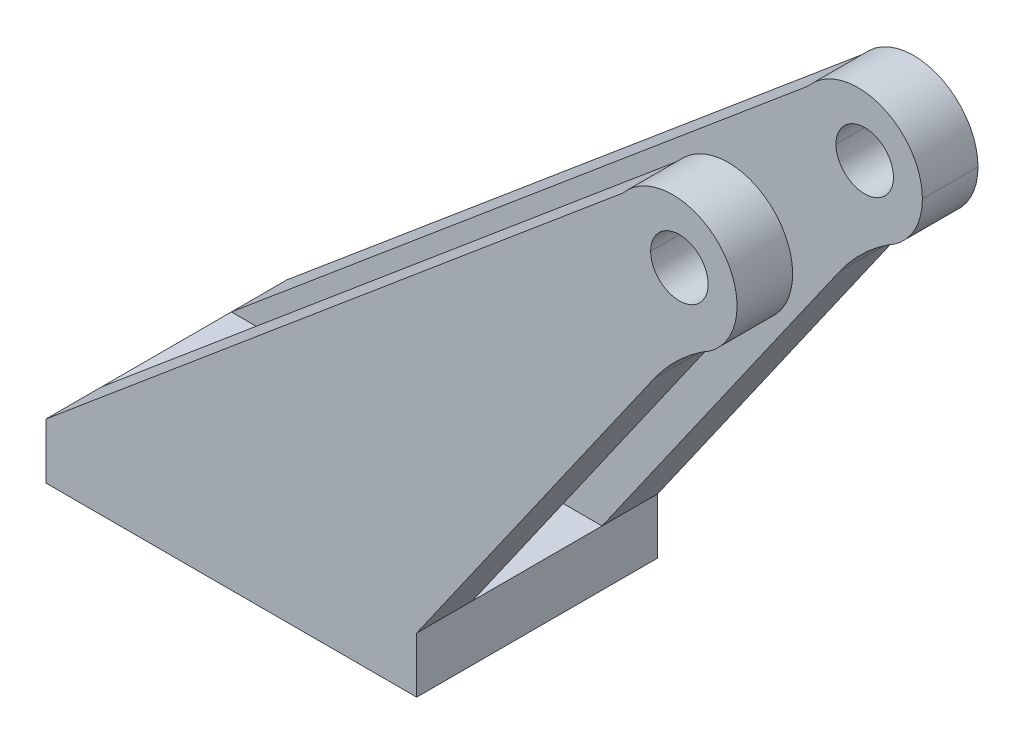
ISO-10303-21;
HEADER;
FILE_DESCRIPTION(('STEP AP214'),'2;1');
FILE_NAME('part.step','',(''),(''),'','','');
FILE_SCHEMA(('AUTOMOTIVE_DESIGN { 1 0 10303 214 1 1 1 1 }'));
ENDSEC;
DATA;
#1=APPLICATION_CONTEXT('core data for automotive mechanical design processes');
#2=APPLICATION_PROTOCOL_DEFINITION('international standard','automotive_design',2000,#1);
#3=PRODUCT_CONTEXT('',#1,'mechanical');
#4=PRODUCT('Part','Part','',(#3));
#5=PRODUCT_RELATED_PRODUCT_CATEGORY('part','',(#4));
#6=PRODUCT_DEFINITION_FORMATION('','',#4);
#7=PRODUCT_DEFINITION_CONTEXT('part definition',#1,'design');
#8=PRODUCT_DEFINITION('design','',#6,#7);
#9=PRODUCT_DEFINITION_SHAPE('','',#8);
#10=(LENGTH_UNIT() NAMED_UNIT(*) SI_UNIT(.MILLI.,.METRE.));
#11=(NAMED_UNIT(*) PLANE_ANGLE_UNIT() SI_UNIT($,.RADIAN.));
#12=(NAMED_UNIT(*) SI_UNIT($,.STERADIAN.) SOLID_ANGLE_UNIT());
#13=UNCERTAINTY_MEASURE_WITH_UNIT(LENGTH_MEASURE(1.E-05),#10,'distance_accuracy_value','');
#14=(GEOMETRIC_REPRESENTATION_CONTEXT(3) GLOBAL_UNCERTAINTY_ASSIGNED_CONTEXT((#13)) GLOBAL_UNIT_ASSIGNED_CONTEXT((#10,
#11,#12)) REPRESENTATION_CONTEXT('',''));
#15=CARTESIAN_POINT('',(0.,0.,0.));
#16=DIRECTION('',(0.,0.,1.));
#17=DIRECTION('',(1.,0.,0.));
#18=AXIS2_PLACEMENT_3D('',#15,#16,#17);
#19=CARTESIAN_POINT('',(59.5129486185114,27.150635094611,-54.2194258680596));
#20=DIRECTION('',(0.,0.,1.));
#21=DIRECTION('',(1.,0.,0.));
#22=AXIS2_PLACEMENT_3D('',#19,#20,#21);
#23=CYLINDRICAL_SURFACE('',#22,1.55);
#24=CARTESIAN_POINT('',(59.5129486185114,27.150635094611,-54.2194258680596));
#25=DIRECTION('',(0.,0.,-1.));
#26=DIRECTION('',(1.,0.,0.));
#27=AXIS2_PLACEMENT_3D('',#24,#25,#26);
#28=CIRCLE('',#27,1.55);
#29=CARTESIAN_POINT('',(61.0629486185114,27.150635094611,-54.2194258680596));
#30=VERTEX_POINT('',#29);
#31=CARTESIAN_POINT('',(57.9629486185114,27.150635094611,-54.2194258680596));
#32=VERTEX_POINT('',#31);
#33=EDGE_CURVE('E11',#30,#32,#28,.T.);
#34=ORIENTED_EDGE('',*,*,#33,.T.);
#35=DIRECTION('',(0.,0.,1.));
#36=VECTOR('',#35,1.);
#37=CARTESIAN_POINT('',(57.9629486185114,27.150635094611,-54.2194258680596));
#38=LINE('',#37,#36);
#39=CARTESIAN_POINT('',(57.9629486185114,27.150635094611,-51.2194258680596));
#40=VERTEX_POINT('',#39);
#41=EDGE_CURVE('E27',#32,#40,#38,.T.);
#42=ORIENTED_EDGE('',*,*,#41,.T.);
#43=CARTESIAN_POINT('',(59.5129486185114,27.150635094611,-51.2194258680596));
#44=DIRECTION('',(0.,0.,-1.));
#45=DIRECTION('',(1.,0.,0.));
#46=AXIS2_PLACEMENT_3D('',#43,#44,#45);
#47=CIRCLE('',#46,1.55);
#48=CARTESIAN_POINT('',(61.0629486185114,27.150635094611,-51.2194258680596));
#49=VERTEX_POINT('',#48);
#50=EDGE_CURVE('E263',#49,#40,#47,.T.);
#51=ORIENTED_EDGE('',*,*,#50,.F.);
#52=DIRECTION('',(0.,0.,1.));
#53=VECTOR('',#52,1.);
#54=CARTESIAN_POINT('',(61.0629486185114,27.150635094611,-54.2194258680596));
#55=LINE('',#54,#53);
#56=EDGE_CURVE('E479',#30,#49,#55,.T.);
#57=ORIENTED_EDGE('',*,*,#56,.F.);
#58=EDGE_LOOP('',(#34,#42,#51,#57));
#59=FACE_BOUND('',#58,.T.);
#60=ADVANCED_FACE('F16',(#59),#23,.F.);
#61=CARTESIAN_POINT('',(59.1535799659421,26.9161629802591,-54.2194258680596));
#62=DIRECTION('',(0.,0.,1.));
#63=DIRECTION('',(1.,0.,0.));
#64=AXIS2_PLACEMENT_3D('',#61,#62,#63);
#65=CYLINDRICAL_SURFACE('',#64,3.47105752236036);
#66=CARTESIAN_POINT('',(59.1535799659421,26.9161629802591,-54.2194258680596));
#67=DIRECTION('',(0.,0.,-1.));
#68=DIRECTION('',(-1.,0.,0.));
#69=AXIS2_PLACEMENT_3D('',#66,#67,#68);
#70=CIRCLE('',#69,3.47105752236037);
#71=CARTESIAN_POINT('',(62.6246374883025,26.9161629802591,-54.2194258680596));
#72=VERTEX_POINT('',#71);
#73=CARTESIAN_POINT('',(60.7457464022657,23.8318078835526,-54.2194258680596));
#74=VERTEX_POINT('',#73);
#75=EDGE_CURVE('E20',#72,#74,#70,.T.);
#76=ORIENTED_EDGE('',*,*,#75,.F.);
#77=DIRECTION('',(0.,0.,1.));
#78=VECTOR('',#77,1.);
#79=CARTESIAN_POINT('',(62.6246374883025,26.9161629802591,-54.2194258680596));
#80=LINE('',#79,#78);
#81=CARTESIAN_POINT('',(62.6246374883025,26.9161629802591,-51.2194258680596));
#82=VERTEX_POINT('',#81);
#83=EDGE_CURVE('E292',#72,#82,#80,.T.);
#84=ORIENTED_EDGE('',*,*,#83,.T.);
#85=CARTESIAN_POINT('',(59.1535799659421,26.9161629802591,-51.2194258680596));
#86=DIRECTION('',(0.,0.,-1.));
#87=DIRECTION('',(-1.,0.,0.));
#88=AXIS2_PLACEMENT_3D('',#85,#86,#87);
#89=CIRCLE('',#88,3.47105752236037);
#90=CARTESIAN_POINT('',(60.7457464022657,23.8318078835526,-51.2194258680596));
#91=VERTEX_POINT('',#90);
#92=EDGE_CURVE('E296',#82,#91,#89,.T.);
#93=ORIENTED_EDGE('',*,*,#92,.T.);
#94=DIRECTION('',(0.,0.,1.));
#95=VECTOR('',#94,1.);
#96=CARTESIAN_POINT('',(60.7457464022657,23.8318078835526,-54.2194258680596));
#97=LINE('',#96,#95);
#98=EDGE_CURVE('E274',#74,#91,#97,.T.);
#99=ORIENTED_EDGE('',*,*,#98,.F.);
#100=EDGE_LOOP('',(#76,#84,#93,#99));
#101=FACE_BOUND('',#100,.T.);
#102=ADVANCED_FACE('F514',(#101),#65,.T.);
#103=CARTESIAN_POINT('',(59.5129486185114,27.150635094611,-41.2194258680597));
#104=DIRECTION('',(0.,0.,-1.));
#105=DIRECTION('',(-1.,0.,0.));
#106=AXIS2_PLACEMENT_3D('',#103,#104,#105);
#107=CYLINDRICAL_SURFACE('',#106,1.55);
#108=CARTESIAN_POINT('',(59.5129486185114,27.150635094611,-41.2194258680597));
#109=DIRECTION('',(0.,0.,1.));
#110=DIRECTION('',(1.,0.,0.));
#111=AXIS2_PLACEMENT_3D('',#108,#109,#110);
#112=CIRCLE('',#111,1.55);
#113=CARTESIAN_POINT('',(57.9629486185114,27.150635094611,-41.2194258680597));
#114=VERTEX_POINT('',#113);
#115=CARTESIAN_POINT('',(61.0629486185114,27.150635094611,-41.2194258680597));
#116=VERTEX_POINT('',#115);
#117=EDGE_CURVE('E343',#114,#116,#112,.T.);
#118=ORIENTED_EDGE('',*,*,#117,.T.);
#119=DIRECTION('',(0.,0.,-1.));
#120=VECTOR('',#119,1.);
#121=CARTESIAN_POINT('',(61.0629486185114,27.150635094611,-41.2194258680597));
#122=LINE('',#121,#120);
#123=CARTESIAN_POINT('',(61.0629486185114,27.150635094611,-44.2194258680597));
#124=VERTEX_POINT('',#123);
#125=EDGE_CURVE('E327',#116,#124,#122,.T.);
#126=ORIENTED_EDGE('',*,*,#125,.T.);
#127=CARTESIAN_POINT('',(59.5129486185114,27.150635094611,-44.2194258680597));
#128=DIRECTION('',(0.,0.,1.));
#129=DIRECTION('',(1.,0.,0.));
#130=AXIS2_PLACEMENT_3D('',#127,#128,#129);
#131=CIRCLE('',#130,1.55);
#132=CARTESIAN_POINT('',(57.9629486185114,27.150635094611,-44.2194258680597));
#133=VERTEX_POINT('',#132);
#134=EDGE_CURVE('E278',#133,#124,#131,.T.);
#135=ORIENTED_EDGE('',*,*,#134,.F.);
#136=DIRECTION('',(0.,0.,-1.));
#137=VECTOR('',#136,1.);
#138=CARTESIAN_POINT('',(57.9629486185114,27.150635094611,-41.2194258680597));
#139=LINE('',#138,#137);
#140=EDGE_CURVE('E367',#114,#133,#139,.T.);
#141=ORIENTED_EDGE('',*,*,#140,.F.);
#142=EDGE_LOOP('',(#118,#126,#135,#141));
#143=FACE_BOUND('',#142,.T.);
#144=ADVANCED_FACE('F519',(#143),#107,.F.);
#145=CARTESIAN_POINT('',(30.3430756374335,3.,-47.7194258680598));
#146=DIRECTION('',(0.,-1.,0.));
#147=DIRECTION('',(0.,0.,-1.));
#148=AXIS2_PLACEMENT_3D('',#145,#146,#147);
#149=CYLINDRICAL_SURFACE('',#148,1.59999999999983);
#150=CARTESIAN_POINT('',(30.3430756374335,3.,-47.7194258680598));
#151=DIRECTION('',(0.,1.,0.));
#152=DIRECTION('',(0.,0.,1.));
#153=AXIS2_PLACEMENT_3D('',#150,#151,#152);
#154=CIRCLE('',#153,1.59999999999983);
#155=CARTESIAN_POINT('',(30.3430756374335,3.,-49.3194258680596));
#156=VERTEX_POINT('',#155);
#157=CARTESIAN_POINT('',(30.3430756374335,3.,-46.1194258680599));
#158=VERTEX_POINT('',#157);
#159=EDGE_CURVE('E323',#156,#158,#154,.T.);
#160=ORIENTED_EDGE('',*,*,#159,.T.);
#161=DIRECTION('',(0.,-1.,0.));
#162=VECTOR('',#161,1.);
#163=CARTESIAN_POINT('',(30.3430756374335,3.,-46.1194258680599));
#164=LINE('',#163,#162);
#165=CARTESIAN_POINT('',(30.3430756374335,0.,-46.1194258680599));
#166=VERTEX_POINT('',#165);
#167=EDGE_CURVE('E238',#158,#166,#164,.T.);
#168=ORIENTED_EDGE('',*,*,#167,.T.);
#169=CARTESIAN_POINT('',(30.3430756374335,0.,-47.7194258680598));
#170=DIRECTION('',(0.,1.,0.));
#171=DIRECTION('',(0.,0.,1.));
#172=AXIS2_PLACEMENT_3D('',#169,#170,#171);
#173=CIRCLE('',#172,1.59999999999983);
#174=CARTESIAN_POINT('',(30.3430756374335,0.,-49.3194258680596));
#175=VERTEX_POINT('',#174);
#176=EDGE_CURVE('E335',#175,#166,#173,.T.);
#177=ORIENTED_EDGE('',*,*,#176,.F.);
#178=DIRECTION('',(0.,-1.,0.));
#179=VECTOR('',#178,1.);
#180=CARTESIAN_POINT('',(30.3430756374335,3.,-49.3194258680596));
#181=LINE('',#180,#179);
#182=EDGE_CURVE('E283',#156,#175,#181,.T.);
#183=ORIENTED_EDGE('',*,*,#182,.F.);
#184=EDGE_LOOP('',(#160,#168,#177,#183));
#185=FACE_BOUND('',#184,.T.);
#186=ADVANCED_FACE('F546',(#185),#149,.F.);
#187=CARTESIAN_POINT('',(40.3430756374337,3.,-47.7194258680598));
#188=DIRECTION('',(0.,-1.,0.));
#189=DIRECTION('',(0.,0.,-1.));
#190=AXIS2_PLACEMENT_3D('',#187,#188,#189);
#191=CYLINDRICAL_SURFACE('',#190,1.59999999999983);
#192=CARTESIAN_POINT('',(40.3430756374337,3.,-47.7194258680598));
#193=DIRECTION('',(0.,1.,0.));
#194=DIRECTION('',(0.,0.,1.));
#195=AXIS2_PLACEMENT_3D('',#192,#193,#194);
#196=CIRCLE('',#195,1.59999999999983);
#197=CARTESIAN_POINT('',(40.3430756374337,3.,-49.3194258680596));
#198=VERTEX_POINT('',#197);
#199=CARTESIAN_POINT('',(40.3430756374337,3.,-46.1194258680599));
#200=VERTEX_POINT('',#199);
#201=EDGE_CURVE('E230',#198,#200,#196,.T.);
#202=ORIENTED_EDGE('',*,*,#201,.T.);
#203=DIRECTION('',(0.,-1.,0.));
#204=VECTOR('',#203,1.);
#205=CARTESIAN_POINT('',(40.3430756374337,3.,-46.1194258680599));
#206=LINE('',#205,#204);
#207=CARTESIAN_POINT('',(40.3430756374337,0.,-46.1194258680599));
#208=VERTEX_POINT('',#207);
#209=EDGE_CURVE('E220',#200,#208,#206,.T.);
#210=ORIENTED_EDGE('',*,*,#209,.T.);
#211=CARTESIAN_POINT('',(40.3430756374337,0.,-47.7194258680598));
#212=DIRECTION('',(0.,1.,0.));
#213=DIRECTION('',(0.,0.,1.));
#214=AXIS2_PLACEMENT_3D('',#211,#212,#213);
#215=CIRCLE('',#214,1.59999999999983);
#216=CARTESIAN_POINT('',(40.3430756374337,0.,-49.3194258680596));
#217=VERTEX_POINT('',#216);
#218=EDGE_CURVE('E334',#217,#208,#215,.T.);
#219=ORIENTED_EDGE('',*,*,#218,.F.);
#220=DIRECTION('',(0.,-1.,0.));
#221=VECTOR('',#220,1.);
#222=CARTESIAN_POINT('',(40.3430756374337,3.,-49.3194258680596));
#223=LINE('',#222,#221);
#224=EDGE_CURVE('E235',#198,#217,#223,.T.);
#225=ORIENTED_EDGE('',*,*,#224,.F.);
#226=EDGE_LOOP('',(#202,#210,#219,#225));
#227=FACE_BOUND('',#226,.T.);
#228=ADVANCED_FACE('F234',(#227),#191,.F.);
#229=CARTESIAN_POINT('',(0.,3.,0.));
#230=DIRECTION('',(0.,-1.,0.));
#231=DIRECTION('',(0.,0.,-1.));
#232=AXIS2_PLACEMENT_3D('',#229,#230,#231);
#233=PLANE('',#232);
#234=DIRECTION('',(0.,0.,-1.));
#235=VECTOR('',#234,1.);
#236=CARTESIAN_POINT('',(45.3430756374336,3.,-51.2194258680596));
#237=LINE('',#236,#235);
#238=CARTESIAN_POINT('',(45.3430756374336,3.,-44.2194258680597));
#239=VERTEX_POINT('',#238);
#240=CARTESIAN_POINT('',(45.3430756374336,3.,-51.2194258680596));
#241=VERTEX_POINT('',#240);
#242=EDGE_CURVE('E231',#239,#241,#237,.T.);
#243=ORIENTED_EDGE('',*,*,#242,.T.);
#244=DIRECTION('',(-1.,0.,0.));
#245=VECTOR('',#244,1.);
#246=CARTESIAN_POINT('',(45.3430756374336,3.,-51.2194258680596));
#247=LINE('',#246,#245);
#248=CARTESIAN_POINT('',(25.3430756374336,3.,-51.2194258680596));
#249=VERTEX_POINT('',#248);
#250=EDGE_CURVE('E415',#241,#249,#247,.T.);
#251=ORIENTED_EDGE('',*,*,#250,.T.);
#252=DIRECTION('',(0.,0.,1.));
#253=VECTOR('',#252,1.);
#254=CARTESIAN_POINT('',(25.3430756374336,3.,-51.2194258680596));
#255=LINE('',#254,#253);
#256=CARTESIAN_POINT('',(25.3430756374336,3.,-44.2194258680597));
#257=VERTEX_POINT('',#256);
#258=EDGE_CURVE('E410',#249,#257,#255,.T.);
#259=ORIENTED_EDGE('',*,*,#258,.T.);
#260=DIRECTION('',(1.,0.,0.));
#261=VECTOR('',#260,1.);
#262=CARTESIAN_POINT('',(45.3430756374336,3.,-44.2194258680597));
#263=LINE('',#262,#261);
#264=EDGE_CURVE('E350',#257,#239,#263,.T.);
#265=ORIENTED_EDGE('',*,*,#264,.T.);
#266=EDGE_LOOP('',(#243,#251,#259,#265));
#267=FACE_BOUND('',#266,.T.);
#268=ORIENTED_EDGE('',*,*,#201,.F.);
#269=CARTESIAN_POINT('',(40.3430756374337,3.,-47.7194258680598));
#270=DIRECTION('',(0.,1.,0.));
#271=DIRECTION('',(0.,0.,1.));
#272=AXIS2_PLACEMENT_3D('',#269,#270,#271);
#273=CIRCLE('',#272,1.59999999999983);
#274=EDGE_CURVE('E224',#200,#198,#273,.T.);
#275=ORIENTED_EDGE('',*,*,#274,.F.);
#276=EDGE_LOOP('',(#268,#275));
#277=FACE_BOUND('',#276,.T.);
#278=ORIENTED_EDGE('',*,*,#159,.F.);
#279=CARTESIAN_POINT('',(30.3430756374335,3.,-47.7194258680598));
#280=DIRECTION('',(0.,1.,0.));
#281=DIRECTION('',(0.,0.,1.));
#282=AXIS2_PLACEMENT_3D('',#279,#280,#281);
#283=CIRCLE('',#282,1.59999999999983);
#284=EDGE_CURVE('E253',#158,#156,#283,.T.);
#285=ORIENTED_EDGE('',*,*,#284,.F.);
#286=EDGE_LOOP('',(#278,#285));
#287=FACE_BOUND('',#286,.T.);
#288=ADVANCED_FACE('F240',(#267,#277,#287),#233,.F.);
#289=CARTESIAN_POINT('',(0.,0.,0.));
#290=DIRECTION('',(0.,-1.,0.));
#291=DIRECTION('',(0.,0.,-1.));
#292=AXIS2_PLACEMENT_3D('',#289,#290,#291);
#293=PLANE('',#292);
#294=DIRECTION('',(0.,0.,-1.));
#295=VECTOR('',#294,1.);
#296=CARTESIAN_POINT('',(45.3430756374336,0.,-51.2194258680596));
#297=LINE('',#296,#295);
#298=CARTESIAN_POINT('',(45.3430756374336,0.,-41.2194258680597));
#299=VERTEX_POINT('',#298);
#300=CARTESIAN_POINT('',(45.3430756374336,0.,-54.2194258680596));
#301=VERTEX_POINT('',#300);
#302=EDGE_CURVE('E311',#299,#301,#297,.T.);
#303=ORIENTED_EDGE('',*,*,#302,.F.);
#304=DIRECTION('',(1.,0.,0.));
#305=VECTOR('',#304,1.);
#306=CARTESIAN_POINT('',(25.3430756374336,0.,-41.2194258680597));
#307=LINE('',#306,#305);
#308=CARTESIAN_POINT('',(25.3430756374336,0.,-41.2194258680597));
#309=VERTEX_POINT('',#308);
#310=EDGE_CURVE('E347',#309,#299,#307,.T.);
#311=ORIENTED_EDGE('',*,*,#310,.F.);
#312=DIRECTION('',(0.,0.,1.));
#313=VECTOR('',#312,1.);
#314=CARTESIAN_POINT('',(25.3430756374336,0.,-51.2194258680596));
#315=LINE('',#314,#313);
#316=CARTESIAN_POINT('',(25.3430756374336,0.,-54.2194258680596));
#317=VERTEX_POINT('',#316);
#318=EDGE_CURVE('E250',#317,#309,#315,.T.);
#319=ORIENTED_EDGE('',*,*,#318,.F.);
#320=DIRECTION('',(-1.,0.,0.));
#321=VECTOR('',#320,1.);
#322=CARTESIAN_POINT('',(45.3430756374336,0.,-54.2194258680596));
#323=LINE('',#322,#321);
#324=EDGE_CURVE('E287',#301,#317,#323,.T.);
#325=ORIENTED_EDGE('',*,*,#324,.F.);
#326=EDGE_LOOP('',(#303,#311,#319,#325));
#327=FACE_BOUND('',#326,.T.);
#328=ORIENTED_EDGE('',*,*,#218,.T.);
#329=CARTESIAN_POINT('',(40.3430756374337,0.,-47.7194258680598));
#330=DIRECTION('',(0.,1.,0.));
#331=DIRECTION('',(0.,0.,1.));
#332=AXIS2_PLACEMENT_3D('',#329,#330,#331);
#333=CIRCLE('',#332,1.59999999999983);
#334=EDGE_CURVE('E226',#208,#217,#333,.T.);
#335=ORIENTED_EDGE('',*,*,#334,.T.);
#336=EDGE_LOOP('',(#328,#335));
#337=FACE_BOUND('',#336,.T.);
#338=ORIENTED_EDGE('',*,*,#176,.T.);
#339=CARTESIAN_POINT('',(30.3430756374335,0.,-47.7194258680598));
#340=DIRECTION('',(0.,1.,0.));
#341=DIRECTION('',(0.,0.,1.));
#342=AXIS2_PLACEMENT_3D('',#339,#340,#341);
#343=CIRCLE('',#342,1.59999999999983);
#344=EDGE_CURVE('E331',#166,#175,#343,.T.);
#345=ORIENTED_EDGE('',*,*,#344,.T.);
#346=EDGE_LOOP('',(#338,#345));
#347=FACE_BOUND('',#346,.T.);
#348=ADVANCED_FACE('F539',(#327,#337,#347),#293,.T.);
#349=CARTESIAN_POINT('',(45.3430756374336,3.,-51.2194258680596));
#350=DIRECTION('',(-1.,0.,0.));
#351=DIRECTION('',(0.,0.,1.));
#352=AXIS2_PLACEMENT_3D('',#349,#350,#351);
#353=PLANE('',#352);
#354=ORIENTED_EDGE('',*,*,#302,.T.);
#355=DIRECTION('',(0.,-1.,0.));
#356=VECTOR('',#355,1.);
#357=CARTESIAN_POINT('',(45.3430756374336,3.,-54.2194258680596));
#358=LINE('',#357,#356);
#359=CARTESIAN_POINT('',(45.3430756374336,3.,-54.2194258680596));
#360=VERTEX_POINT('',#359);
#361=EDGE_CURVE('E289',#360,#301,#358,.T.);
#362=ORIENTED_EDGE('',*,*,#361,.F.);
#363=DIRECTION('',(0.,0.,1.));
#364=VECTOR('',#363,1.);
#365=CARTESIAN_POINT('',(45.3430756374336,3.,-54.2194258680596));
#366=LINE('',#365,#364);
#367=EDGE_CURVE('E308',#360,#241,#366,.T.);
#368=ORIENTED_EDGE('',*,*,#367,.T.);
#369=ORIENTED_EDGE('',*,*,#242,.F.);
#370=DIRECTION('',(0.,0.,-1.));
#371=VECTOR('',#370,1.);
#372=CARTESIAN_POINT('',(45.3430756374336,3.,-41.2194258680597));
#373=LINE('',#372,#371);
#374=CARTESIAN_POINT('',(45.3430756374336,3.,-41.2194258680597));
#375=VERTEX_POINT('',#374);
#376=EDGE_CURVE('E336',#375,#239,#373,.T.);
#377=ORIENTED_EDGE('',*,*,#376,.F.);
#378=DIRECTION('',(0.,1.,0.));
#379=VECTOR('',#378,1.);
#380=CARTESIAN_POINT('',(45.3430756374336,3.,-41.2194258680597));
#381=LINE('',#380,#379);
#382=EDGE_CURVE('E306',#299,#375,#381,.T.);
#383=ORIENTED_EDGE('',*,*,#382,.F.);
#384=EDGE_LOOP('',(#354,#362,#368,#369,#377,#383));
#385=FACE_BOUND('',#384,.T.);
#386=ADVANCED_FACE('F18',(#385),#353,.F.);
#387=CARTESIAN_POINT('',(25.3430756374336,3.,-51.2194258680596));
#388=DIRECTION('',(1.,0.,0.));
#389=DIRECTION('',(0.,1.,0.));
#390=AXIS2_PLACEMENT_3D('',#387,#388,#389);
#391=PLANE('',#390);
#392=ORIENTED_EDGE('',*,*,#318,.T.);
#393=DIRECTION('',(0.,-1.,0.));
#394=VECTOR('',#393,1.);
#395=CARTESIAN_POINT('',(25.3430756374336,3.,-41.2194258680597));
#396=LINE('',#395,#394);
#397=CARTESIAN_POINT('',(25.3430756374336,3.,-41.2194258680597));
#398=VERTEX_POINT('',#397);
#399=EDGE_CURVE('E286',#398,#309,#396,.T.);
#400=ORIENTED_EDGE('',*,*,#399,.F.);
#401=DIRECTION('',(0.,0.,-1.));
#402=VECTOR('',#401,1.);
#403=CARTESIAN_POINT('',(25.3430756374336,3.,-41.2194258680597));
#404=LINE('',#403,#402);
#405=EDGE_CURVE('E243',#398,#257,#404,.T.);
#406=ORIENTED_EDGE('',*,*,#405,.T.);
#407=ORIENTED_EDGE('',*,*,#258,.F.);
#408=DIRECTION('',(0.,0.,1.));
#409=VECTOR('',#408,1.);
#410=CARTESIAN_POINT('',(25.3430756374336,3.,-54.2194258680596));
#411=LINE('',#410,#409);
#412=CARTESIAN_POINT('',(25.3430756374336,3.,-54.2194258680596));
#413=VERTEX_POINT('',#412);
#414=EDGE_CURVE('E297',#413,#249,#411,.T.);
#415=ORIENTED_EDGE('',*,*,#414,.F.);
#416=DIRECTION('',(0.,1.,0.));
#417=VECTOR('',#416,1.);
#418=CARTESIAN_POINT('',(25.3430756374336,3.,-54.2194258680596));
#419=LINE('',#418,#417);
#420=EDGE_CURVE('E290',#317,#413,#419,.T.);
#421=ORIENTED_EDGE('',*,*,#420,.F.);
#422=EDGE_LOOP('',(#392,#400,#406,#407,#415,#421));
#423=FACE_BOUND('',#422,.T.);
#424=ADVANCED_FACE('F543',(#423),#391,.F.);
#425=CARTESIAN_POINT('',(40.3430756374337,3.,-47.7194258680598));
#426=DIRECTION('',(0.,-1.,0.));
#427=DIRECTION('',(0.,0.,-1.));
#428=AXIS2_PLACEMENT_3D('',#425,#426,#427);
#429=CYLINDRICAL_SURFACE('',#428,1.59999999999983);
#430=ORIENTED_EDGE('',*,*,#209,.F.);
#431=ORIENTED_EDGE('',*,*,#274,.T.);
#432=ORIENTED_EDGE('',*,*,#224,.T.);
#433=ORIENTED_EDGE('',*,*,#334,.F.);
#434=EDGE_LOOP('',(#430,#431,#432,#433));
#435=FACE_BOUND('',#434,.T.);
#436=ADVANCED_FACE('F222',(#435),#429,.F.);
#437=CARTESIAN_POINT('',(30.3430756374335,3.,-47.7194258680598));
#438=DIRECTION('',(0.,-1.,0.));
#439=DIRECTION('',(0.,0.,-1.));
#440=AXIS2_PLACEMENT_3D('',#437,#438,#439);
#441=CYLINDRICAL_SURFACE('',#440,1.59999999999983);
#442=ORIENTED_EDGE('',*,*,#167,.F.);
#443=ORIENTED_EDGE('',*,*,#284,.T.);
#444=ORIENTED_EDGE('',*,*,#182,.T.);
#445=ORIENTED_EDGE('',*,*,#344,.F.);
#446=EDGE_LOOP('',(#442,#443,#444,#445));
#447=FACE_BOUND('',#446,.T.);
#448=ADVANCED_FACE('F531',(#447),#441,.F.);
#449=CARTESIAN_POINT('',(66.3277408616516,15.5347398559067,-41.2194258680597));
#450=DIRECTION('',(0.,0.,1.));
#451=DIRECTION('',(1.,0.,0.));
#452=AXIS2_PLACEMENT_3D('',#449,#450,#451);
#453=PLANE('',#452);
#454=ORIENTED_EDGE('',*,*,#399,.T.);
#455=ORIENTED_EDGE('',*,*,#310,.T.);
#456=ORIENTED_EDGE('',*,*,#382,.T.);
#457=DIRECTION('',(0.573576436351045,0.819152044288992,0.));
#458=VECTOR('',#457,1.);
#459=CARTESIAN_POINT('',(45.3430756374336,3.,-41.2194258680597));
#460=LINE('',#459,#458);
#461=CARTESIAN_POINT('',(58.1362204187617,21.2705042194171,-41.2194258680597));
#462=VERTEX_POINT('',#461);
#463=EDGE_CURVE('E302',#375,#462,#460,.T.);
#464=ORIENTED_EDGE('',*,*,#463,.T.);
#465=CARTESIAN_POINT('',(66.3277408616516,15.5347398559067,-41.2194258680597));
#466=DIRECTION('',(0.,0.,-1.));
#467=DIRECTION('',(1.,0.,0.));
#468=AXIS2_PLACEMENT_3D('',#465,#466,#467);
#469=CIRCLE('',#468,10.);
#470=CARTESIAN_POINT('',(60.7457464022657,23.8318078835526,-41.2194258680597));
#471=VERTEX_POINT('',#470);
#472=EDGE_CURVE('E307',#462,#471,#469,.T.);
#473=ORIENTED_EDGE('',*,*,#472,.T.);
#474=CARTESIAN_POINT('',(59.1535799659421,26.9161629802591,-41.2194258680597));
#475=DIRECTION('',(0.,0.,1.));
#476=DIRECTION('',(-1.,0.,0.));
#477=AXIS2_PLACEMENT_3D('',#474,#475,#476);
#478=CIRCLE('',#477,3.47105752236037);
#479=CARTESIAN_POINT('',(56.4724291693294,29.1206290674007,-41.2194258680597));
#480=VERTEX_POINT('',#479);
#481=EDGE_CURVE('E393',#471,#480,#478,.T.);
#482=ORIENTED_EDGE('',*,*,#481,.T.);
#483=DIRECTION('',(-0.766044443118982,-0.642787609686535,0.));
#484=VECTOR('',#483,1.);
#485=CARTESIAN_POINT('',(56.4724291693294,29.1206290674007,-41.2194258680597));
#486=LINE('',#485,#484);
#487=EDGE_CURVE('E280',#480,#398,#486,.T.);
#488=ORIENTED_EDGE('',*,*,#487,.T.);
#489=EDGE_LOOP('',(#454,#455,#456,#464,#473,#482,#488));
#490=FACE_BOUND('',#489,.T.);
#491=ORIENTED_EDGE('',*,*,#117,.F.);
#492=CARTESIAN_POINT('',(59.5129486185114,27.150635094611,-41.2194258680597));
#493=DIRECTION('',(0.,0.,1.));
#494=DIRECTION('',(1.,0.,0.));
#495=AXIS2_PLACEMENT_3D('',#492,#493,#494);
#496=CIRCLE('',#495,1.55);
#497=EDGE_CURVE('E363',#116,#114,#496,.T.);
#498=ORIENTED_EDGE('',*,*,#497,.F.);
#499=EDGE_LOOP('',(#491,#498));
#500=FACE_BOUND('',#499,.T.);
#501=ADVANCED_FACE('F428',(#490,#500),#453,.T.);
#502=CARTESIAN_POINT('',(66.3277408616516,15.5347398559067,-44.2194258680597));
#503=DIRECTION('',(0.,0.,1.));
#504=DIRECTION('',(1.,0.,0.));
#505=AXIS2_PLACEMENT_3D('',#502,#503,#504);
#506=PLANE('',#505);
#507=ORIENTED_EDGE('',*,*,#264,.F.);
#508=DIRECTION('',(-0.766044443118982,-0.642787609686535,0.));
#509=VECTOR('',#508,1.);
#510=CARTESIAN_POINT('',(56.4724291693294,29.1206290674007,-44.2194258680597));
#511=LINE('',#510,#509);
#512=CARTESIAN_POINT('',(56.4724291693294,29.1206290674007,-44.2194258680597));
#513=VERTEX_POINT('',#512);
#514=EDGE_CURVE('E268',#513,#257,#511,.T.);
#515=ORIENTED_EDGE('',*,*,#514,.F.);
#516=CARTESIAN_POINT('',(59.1535799659421,26.9161629802591,-44.2194258680597));
#517=DIRECTION('',(0.,0.,1.));
#518=DIRECTION('',(-1.,0.,0.));
#519=AXIS2_PLACEMENT_3D('',#516,#517,#518);
#520=CIRCLE('',#519,3.47105752236037);
#521=CARTESIAN_POINT('',(60.7457464022657,23.8318078835526,-44.2194258680597));
#522=VERTEX_POINT('',#521);
#523=EDGE_CURVE('E316',#522,#513,#520,.T.);
#524=ORIENTED_EDGE('',*,*,#523,.F.);
#525=CARTESIAN_POINT('',(66.3277408616516,15.5347398559067,-44.2194258680597));
#526=DIRECTION('',(0.,0.,-1.));
#527=DIRECTION('',(1.,0.,0.));
#528=AXIS2_PLACEMENT_3D('',#525,#526,#527);
#529=CIRCLE('',#528,10.);
#530=CARTESIAN_POINT('',(58.1362204187617,21.2705042194171,-44.2194258680597));
#531=VERTEX_POINT('',#530);
#532=EDGE_CURVE('E164',#531,#522,#529,.T.);
#533=ORIENTED_EDGE('',*,*,#532,.F.);
#534=DIRECTION('',(0.573576436351045,0.819152044288992,0.));
#535=VECTOR('',#534,1.);
#536=CARTESIAN_POINT('',(45.3430756374336,3.,-44.2194258680597));
#537=LINE('',#536,#535);
#538=EDGE_CURVE('E339',#239,#531,#537,.T.);
#539=ORIENTED_EDGE('',*,*,#538,.F.);
#540=EDGE_LOOP('',(#507,#515,#524,#533,#539));
#541=FACE_BOUND('',#540,.T.);
#542=ORIENTED_EDGE('',*,*,#134,.T.);
#543=CARTESIAN_POINT('',(59.5129486185114,27.150635094611,-44.2194258680597));
#544=DIRECTION('',(0.,0.,1.));
#545=DIRECTION('',(1.,0.,0.));
#546=AXIS2_PLACEMENT_3D('',#543,#544,#545);
#547=CIRCLE('',#546,1.55);
#548=EDGE_CURVE('E281',#124,#133,#547,.T.);
#549=ORIENTED_EDGE('',*,*,#548,.T.);
#550=EDGE_LOOP('',(#542,#549));
#551=FACE_BOUND('',#550,.T.);
#552=ADVANCED_FACE('F403',(#541,#551),#506,.F.);
#553=CARTESIAN_POINT('',(45.3430756374336,3.,-41.2194258680597));
#554=DIRECTION('',(-0.819152044288992,0.573576436351045,0.));
#555=DIRECTION('',(0.,0.,1.));
#556=AXIS2_PLACEMENT_3D('',#553,#554,#555);
#557=PLANE('',#556);
#558=ORIENTED_EDGE('',*,*,#538,.T.);
#559=DIRECTION('',(0.,0.,-1.));
#560=VECTOR('',#559,1.);
#561=CARTESIAN_POINT('',(58.1362204187617,21.2705042194171,-41.2194258680597));
#562=LINE('',#561,#560);
#563=EDGE_CURVE('E312',#462,#531,#562,.T.);
#564=ORIENTED_EDGE('',*,*,#563,.F.);
#565=ORIENTED_EDGE('',*,*,#463,.F.);
#566=ORIENTED_EDGE('',*,*,#376,.T.);
#567=EDGE_LOOP('',(#558,#564,#565,#566));
#568=FACE_BOUND('',#567,.T.);
#569=ADVANCED_FACE('F400',(#568),#557,.F.);
#570=CARTESIAN_POINT('',(66.3277408616516,15.5347398559067,-41.2194258680597));
#571=DIRECTION('',(0.,0.,-1.));
#572=DIRECTION('',(-1.,0.,0.));
#573=AXIS2_PLACEMENT_3D('',#570,#571,#572);
#574=CYLINDRICAL_SURFACE('',#573,10.);
#575=ORIENTED_EDGE('',*,*,#532,.T.);
#576=DIRECTION('',(0.,0.,-1.));
#577=VECTOR('',#576,1.);
#578=CARTESIAN_POINT('',(60.7457464022657,23.8318078835526,-41.2194258680597));
#579=LINE('',#578,#577);
#580=EDGE_CURVE('E272',#471,#522,#579,.T.);
#581=ORIENTED_EDGE('',*,*,#580,.F.);
#582=ORIENTED_EDGE('',*,*,#472,.F.);
#583=ORIENTED_EDGE('',*,*,#563,.T.);
#584=EDGE_LOOP('',(#575,#581,#582,#583));
#585=FACE_BOUND('',#584,.T.);
#586=ADVANCED_FACE('F396',(#585),#574,.F.);
#587=CARTESIAN_POINT('',(59.1535799659421,26.9161629802591,-41.2194258680597));
#588=DIRECTION('',(0.,0.,-1.));
#589=DIRECTION('',(-1.,0.,0.));
#590=AXIS2_PLACEMENT_3D('',#587,#588,#589);
#591=CYLINDRICAL_SURFACE('',#590,3.47105752236037);
#592=ORIENTED_EDGE('',*,*,#523,.T.);
#593=DIRECTION('',(0.,0.,-1.));
#594=VECTOR('',#593,1.);
#595=CARTESIAN_POINT('',(56.4724291693294,29.1206290674007,-41.2194258680597));
#596=LINE('',#595,#594);
#597=EDGE_CURVE('E273',#480,#513,#596,.T.);
#598=ORIENTED_EDGE('',*,*,#597,.F.);
#599=ORIENTED_EDGE('',*,*,#481,.F.);
#600=ORIENTED_EDGE('',*,*,#580,.T.);
#601=EDGE_LOOP('',(#592,#598,#599,#600));
#602=FACE_BOUND('',#601,.T.);
#603=ADVANCED_FACE('F390',(#602),#591,.T.);
#604=CARTESIAN_POINT('',(56.4724291693294,29.1206290674007,-41.2194258680597));
#605=DIRECTION('',(0.642787609686535,-0.766044443118982,0.));
#606=DIRECTION('',(0.,0.,-1.));
#607=AXIS2_PLACEMENT_3D('',#604,#605,#606);
#608=PLANE('',#607);
#609=ORIENTED_EDGE('',*,*,#514,.T.);
#610=ORIENTED_EDGE('',*,*,#405,.F.);
#611=ORIENTED_EDGE('',*,*,#487,.F.);
#612=ORIENTED_EDGE('',*,*,#597,.T.);
#613=EDGE_LOOP('',(#609,#610,#611,#612));
#614=FACE_BOUND('',#613,.T.);
#615=ADVANCED_FACE('F422',(#614),#608,.F.);
#616=CARTESIAN_POINT('',(59.5129486185114,27.150635094611,-41.2194258680597));
#617=DIRECTION('',(0.,0.,-1.));
#618=DIRECTION('',(-1.,0.,0.));
#619=AXIS2_PLACEMENT_3D('',#616,#617,#618);
#620=CYLINDRICAL_SURFACE('',#619,1.55);
#621=ORIENTED_EDGE('',*,*,#125,.F.);
#622=ORIENTED_EDGE('',*,*,#497,.T.);
#623=ORIENTED_EDGE('',*,*,#140,.T.);
#624=ORIENTED_EDGE('',*,*,#548,.F.);
#625=EDGE_LOOP('',(#621,#622,#623,#624));
#626=FACE_BOUND('',#625,.T.);
#627=ADVANCED_FACE('F509',(#626),#620,.F.);
#628=CARTESIAN_POINT('',(59.1535799659421,26.9161629802591,-54.2194258680596));
#629=DIRECTION('',(0.,0.,-1.));
#630=DIRECTION('',(0.,-1.,0.));
#631=AXIS2_PLACEMENT_3D('',#628,#629,#630);
#632=PLANE('',#631);
#633=ORIENTED_EDGE('',*,*,#361,.T.);
#634=ORIENTED_EDGE('',*,*,#324,.T.);
#635=ORIENTED_EDGE('',*,*,#420,.T.);
#636=DIRECTION('',(0.766044443118982,0.642787609686535,0.));
#637=VECTOR('',#636,1.);
#638=CARTESIAN_POINT('',(56.4724291693294,29.1206290674007,-54.2194258680596));
#639=LINE('',#638,#637);
#640=CARTESIAN_POINT('',(56.4724291693294,29.1206290674007,-54.2194258680596));
#641=VERTEX_POINT('',#640);
#642=EDGE_CURVE('E317',#413,#641,#639,.T.);
#643=ORIENTED_EDGE('',*,*,#642,.T.);
#644=CARTESIAN_POINT('',(59.1535799659421,26.9161629802591,-54.2194258680596));
#645=DIRECTION('',(0.,0.,-1.));
#646=DIRECTION('',(-1.,0.,0.));
#647=AXIS2_PLACEMENT_3D('',#644,#645,#646);
#648=CIRCLE('',#647,3.47105752236037);
#649=EDGE_CURVE('E177',#641,#72,#648,.T.);
#650=ORIENTED_EDGE('',*,*,#649,.T.);
#651=ORIENTED_EDGE('',*,*,#75,.T.);
#652=CARTESIAN_POINT('',(66.3277408616516,15.5347398559067,-54.2194258680596));
#653=DIRECTION('',(0.,0.,1.));
#654=DIRECTION('',(1.,0.,0.));
#655=AXIS2_PLACEMENT_3D('',#652,#653,#654);
#656=CIRCLE('',#655,10.);
#657=CARTESIAN_POINT('',(58.1362204187617,21.2705042194171,-54.2194258680596));
#658=VERTEX_POINT('',#657);
#659=EDGE_CURVE('E376',#74,#658,#656,.T.);
#660=ORIENTED_EDGE('',*,*,#659,.T.);
#661=DIRECTION('',(-0.573576436351045,-0.819152044288992,0.));
#662=VECTOR('',#661,1.);
#663=CARTESIAN_POINT('',(45.3430756374336,3.,-54.2194258680596));
#664=LINE('',#663,#662);
#665=EDGE_CURVE('E266',#658,#360,#664,.T.);
#666=ORIENTED_EDGE('',*,*,#665,.T.);
#667=EDGE_LOOP('',(#633,#634,#635,#643,#650,#651,#660,#666));
#668=FACE_BOUND('',#667,.T.);
#669=ORIENTED_EDGE('',*,*,#33,.F.);
#670=CARTESIAN_POINT('',(59.5129486185114,27.150635094611,-54.2194258680596));
#671=DIRECTION('',(0.,0.,-1.));
#672=DIRECTION('',(1.,0.,0.));
#673=AXIS2_PLACEMENT_3D('',#670,#671,#672);
#674=CIRCLE('',#673,1.55);
#675=EDGE_CURVE('E359',#32,#30,#674,.T.);
#676=ORIENTED_EDGE('',*,*,#675,.F.);
#677=EDGE_LOOP('',(#669,#676));
#678=FACE_BOUND('',#677,.T.);
#679=ADVANCED_FACE('F498',(#668,#678),#632,.T.);
#680=CARTESIAN_POINT('',(59.1535799659421,26.9161629802591,-51.2194258680596));
#681=DIRECTION('',(0.,0.,-1.));
#682=DIRECTION('',(0.,-1.,0.));
#683=AXIS2_PLACEMENT_3D('',#680,#681,#682);
#684=PLANE('',#683);
#685=ORIENTED_EDGE('',*,*,#250,.F.);
#686=DIRECTION('',(-0.573576436351045,-0.819152044288992,0.));
#687=VECTOR('',#686,1.);
#688=CARTESIAN_POINT('',(45.3430756374336,3.,-51.2194258680596));
#689=LINE('',#688,#687);
#690=CARTESIAN_POINT('',(58.1362204187617,21.2705042194171,-51.2194258680596));
#691=VERTEX_POINT('',#690);
#692=EDGE_CURVE('E277',#691,#241,#689,.T.);
#693=ORIENTED_EDGE('',*,*,#692,.F.);
#694=CARTESIAN_POINT('',(66.3277408616516,15.5347398559067,-51.2194258680596));
#695=DIRECTION('',(0.,0.,1.));
#696=DIRECTION('',(1.,0.,0.));
#697=AXIS2_PLACEMENT_3D('',#694,#695,#696);
#698=CIRCLE('',#697,10.);
#699=EDGE_CURVE('E262',#91,#691,#698,.T.);
#700=ORIENTED_EDGE('',*,*,#699,.F.);
#701=ORIENTED_EDGE('',*,*,#92,.F.);
#702=CARTESIAN_POINT('',(59.1535799659421,26.9161629802591,-51.2194258680596));
#703=DIRECTION('',(0.,0.,-1.));
#704=DIRECTION('',(-1.,0.,0.));
#705=AXIS2_PLACEMENT_3D('',#702,#703,#704);
#706=CIRCLE('',#705,3.47105752236037);
#707=CARTESIAN_POINT('',(56.4724291693294,29.1206290674007,-51.2194258680596));
#708=VERTEX_POINT('',#707);
#709=EDGE_CURVE('E258',#708,#82,#706,.T.);
#710=ORIENTED_EDGE('',*,*,#709,.F.);
#711=DIRECTION('',(0.766044443118982,0.642787609686535,0.));
#712=VECTOR('',#711,1.);
#713=CARTESIAN_POINT('',(56.4724291693294,29.1206290674007,-51.2194258680596));
#714=LINE('',#713,#712);
#715=EDGE_CURVE('E301',#249,#708,#714,.T.);
#716=ORIENTED_EDGE('',*,*,#715,.F.);
#717=EDGE_LOOP('',(#685,#693,#700,#701,#710,#716));
#718=FACE_BOUND('',#717,.T.);
#719=ORIENTED_EDGE('',*,*,#50,.T.);
#720=CARTESIAN_POINT('',(59.5129486185114,27.150635094611,-51.2194258680596));
#721=DIRECTION('',(0.,0.,-1.));
#722=DIRECTION('',(1.,0.,0.));
#723=AXIS2_PLACEMENT_3D('',#720,#721,#722);
#724=CIRCLE('',#723,1.55);
#725=EDGE_CURVE('E267',#40,#49,#724,.T.);
#726=ORIENTED_EDGE('',*,*,#725,.T.);
#727=EDGE_LOOP('',(#719,#726));
#728=FACE_BOUND('',#727,.T.);
#729=ADVANCED_FACE('F495',(#718,#728),#684,.F.);
#730=CARTESIAN_POINT('',(56.4724291693294,29.1206290674007,-54.2194258680596));
#731=DIRECTION('',(0.642787609686535,-0.766044443118982,0.));
#732=DIRECTION('',(0.,0.,-1.));
#733=AXIS2_PLACEMENT_3D('',#730,#731,#732);
#734=PLANE('',#733);
#735=ORIENTED_EDGE('',*,*,#715,.T.);
#736=DIRECTION('',(0.,0.,1.));
#737=VECTOR('',#736,1.);
#738=CARTESIAN_POINT('',(56.4724291693294,29.1206290674007,-54.2194258680596));
#739=LINE('',#738,#737);
#740=EDGE_CURVE('E261',#641,#708,#739,.T.);
#741=ORIENTED_EDGE('',*,*,#740,.F.);
#742=ORIENTED_EDGE('',*,*,#642,.F.);
#743=ORIENTED_EDGE('',*,*,#414,.T.);
#744=EDGE_LOOP('',(#735,#741,#742,#743));
#745=FACE_BOUND('',#744,.T.);
#746=ADVANCED_FACE('F497',(#745),#734,.F.);
#747=CARTESIAN_POINT('',(59.1535799659421,26.9161629802591,-54.2194258680596));
#748=DIRECTION('',(0.,0.,1.));
#749=DIRECTION('',(1.,0.,0.));
#750=AXIS2_PLACEMENT_3D('',#747,#748,#749);
#751=CYLINDRICAL_SURFACE('',#750,3.47105752236036);
#752=ORIENTED_EDGE('',*,*,#83,.F.);
#753=ORIENTED_EDGE('',*,*,#649,.F.);
#754=ORIENTED_EDGE('',*,*,#740,.T.);
#755=ORIENTED_EDGE('',*,*,#709,.T.);
#756=EDGE_LOOP('',(#752,#753,#754,#755));
#757=FACE_BOUND('',#756,.T.);
#758=ADVANCED_FACE('F506',(#757),#751,.T.);
#759=CARTESIAN_POINT('',(66.3277408616516,15.5347398559067,-54.2194258680596));
#760=DIRECTION('',(0.,0.,1.));
#761=DIRECTION('',(1.,0.,0.));
#762=AXIS2_PLACEMENT_3D('',#759,#760,#761);
#763=CYLINDRICAL_SURFACE('',#762,10.);
#764=ORIENTED_EDGE('',*,*,#699,.T.);
#765=DIRECTION('',(0.,0.,1.));
#766=VECTOR('',#765,1.);
#767=CARTESIAN_POINT('',(58.1362204187617,21.2705042194171,-54.2194258680596));
#768=LINE('',#767,#766);
#769=EDGE_CURVE('E355',#658,#691,#768,.T.);
#770=ORIENTED_EDGE('',*,*,#769,.F.);
#771=ORIENTED_EDGE('',*,*,#659,.F.);
#772=ORIENTED_EDGE('',*,*,#98,.T.);
#773=EDGE_LOOP('',(#764,#770,#771,#772));
#774=FACE_BOUND('',#773,.T.);
#775=ADVANCED_FACE('F526',(#774),#763,.F.);
#776=CARTESIAN_POINT('',(45.3430756374336,3.,-54.2194258680596));
#777=DIRECTION('',(-0.819152044288992,0.573576436351045,0.));
#778=DIRECTION('',(0.,0.,1.));
#779=AXIS2_PLACEMENT_3D('',#776,#777,#778);
#780=PLANE('',#779);
#781=ORIENTED_EDGE('',*,*,#692,.T.);
#782=ORIENTED_EDGE('',*,*,#367,.F.);
#783=ORIENTED_EDGE('',*,*,#665,.F.);
#784=ORIENTED_EDGE('',*,*,#769,.T.);
#785=EDGE_LOOP('',(#781,#782,#783,#784));
#786=FACE_BOUND('',#785,.T.);
#787=ADVANCED_FACE('F530',(#786),#780,.F.);
#788=CARTESIAN_POINT('',(59.5129486185114,27.150635094611,-54.2194258680596));
#789=DIRECTION('',(0.,0.,1.));
#790=DIRECTION('',(1.,0.,0.));
#791=AXIS2_PLACEMENT_3D('',#788,#789,#790);
#792=CYLINDRICAL_SURFACE('',#791,1.55);
#793=ORIENTED_EDGE('',*,*,#41,.F.);
#794=ORIENTED_EDGE('',*,*,#675,.T.);
#795=ORIENTED_EDGE('',*,*,#56,.T.);
#796=ORIENTED_EDGE('',*,*,#725,.F.);
#797=EDGE_LOOP('',(#793,#794,#795,#796));
#798=FACE_BOUND('',#797,.T.);
#799=ADVANCED_FACE('F490',(#798),#792,.F.);
#800=CLOSED_SHELL('',(#60,#102,#144,#186,#228,#288,#348,#386,#424,#436,#448,#501,#552,#569,#586,
#603,#615,#627,#679,#729,#746,#758,#775,#787,#799));
#801=MANIFOLD_SOLID_BREP('B1',#800);
#802=ADVANCED_BREP_SHAPE_REPRESENTATION('',(#18,#801),#14);
#803=SHAPE_DEFINITION_REPRESENTATION(#9,#802);
ENDSEC;
END-ISO-10303-21;
